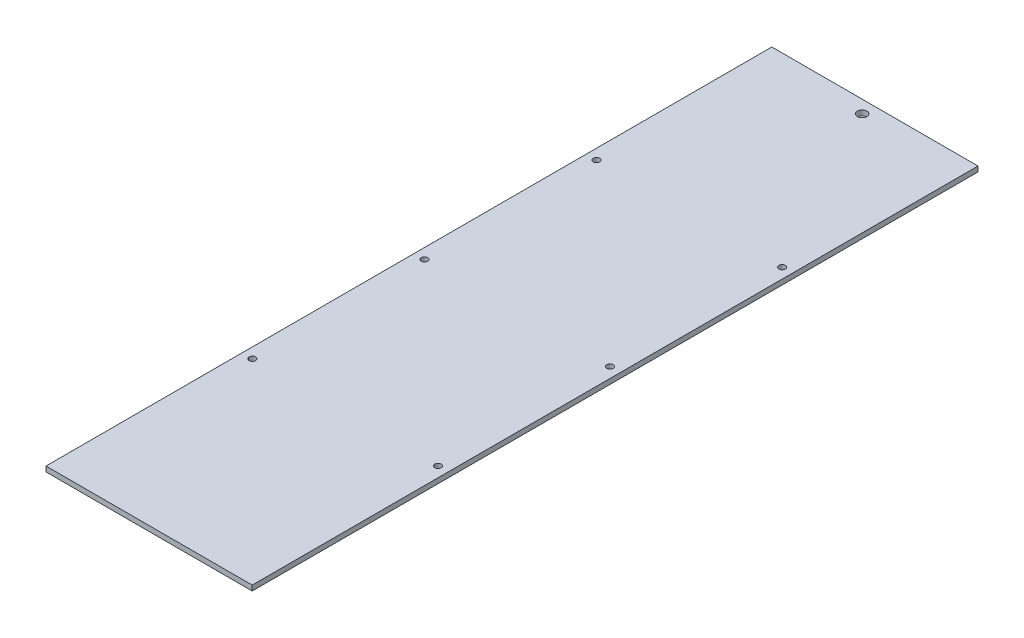
ISO-10303-21;
HEADER;
FILE_DESCRIPTION(('STEP AP214'),'2;1');
FILE_NAME('part.step','',(''),(''),'','','');
FILE_SCHEMA(('AUTOMOTIVE_DESIGN { 1 0 10303 214 1 1 1 1 }'));
ENDSEC;
DATA;
#1=APPLICATION_CONTEXT('core data for automotive mechanical design processes');
#2=APPLICATION_PROTOCOL_DEFINITION('international standard','automotive_design',2000,#1);
#3=PRODUCT_CONTEXT('',#1,'mechanical');
#4=PRODUCT('Part','Part','',(#3));
#5=PRODUCT_RELATED_PRODUCT_CATEGORY('part','',(#4));
#6=PRODUCT_DEFINITION_FORMATION('','',#4);
#7=PRODUCT_DEFINITION_CONTEXT('part definition',#1,'design');
#8=PRODUCT_DEFINITION('design','',#6,#7);
#9=PRODUCT_DEFINITION_SHAPE('','',#8);
#10=(LENGTH_UNIT() NAMED_UNIT(*) SI_UNIT(.MILLI.,.METRE.));
#11=(NAMED_UNIT(*) PLANE_ANGLE_UNIT() SI_UNIT($,.RADIAN.));
#12=(NAMED_UNIT(*) SI_UNIT($,.STERADIAN.) SOLID_ANGLE_UNIT());
#13=UNCERTAINTY_MEASURE_WITH_UNIT(LENGTH_MEASURE(1.E-05),#10,'distance_accuracy_value','');
#14=(GEOMETRIC_REPRESENTATION_CONTEXT(3) GLOBAL_UNCERTAINTY_ASSIGNED_CONTEXT((#13)) GLOBAL_UNIT_ASSIGNED_CONTEXT((#10,
#11,#12)) REPRESENTATION_CONTEXT('',''));
#15=CARTESIAN_POINT('',(0.,0.,0.));
#16=DIRECTION('',(0.,0.,1.));
#17=DIRECTION('',(1.,0.,0.));
#18=AXIS2_PLACEMENT_3D('',#15,#16,#17);
#19=CARTESIAN_POINT('',(0.,2.,0.));
#20=DIRECTION('',(0.,-1.,0.));
#21=DIRECTION('',(0.,0.,-1.));
#22=AXIS2_PLACEMENT_3D('',#19,#20,#21);
#23=PLANE('',#22);
#24=CARTESIAN_POINT('',(36.,2.,-2.04999999999997));
#25=DIRECTION('',(0.,-1.,0.));
#26=DIRECTION('',(0.,0.,1.));
#27=AXIS2_PLACEMENT_3D('',#24,#25,#26);
#28=CIRCLE('',#27,1.25);
#29=CARTESIAN_POINT('',(36.,2.,-0.799999999999971));
#30=VERTEX_POINT('',#29);
#31=EDGE_CURVE('E167',#30,#30,#28,.T.);
#32=ORIENTED_EDGE('',*,*,#31,.T.);
#33=EDGE_LOOP('',(#32));
#34=FACE_BOUND('',#33,.T.);
#35=CARTESIAN_POINT('',(-36.,2.,64.71));
#36=DIRECTION('',(0.,1.,0.));
#37=DIRECTION('',(0.,0.,1.));
#38=AXIS2_PLACEMENT_3D('',#35,#36,#37);
#39=CIRCLE('',#38,1.25);
#40=CARTESIAN_POINT('',(-36.,2.,65.96));
#41=VERTEX_POINT('',#40);
#42=EDGE_CURVE('E11',#41,#41,#39,.T.);
#43=ORIENTED_EDGE('',*,*,#42,.F.);
#44=EDGE_LOOP('',(#43));
#45=FACE_BOUND('',#44,.T.);
#46=DIRECTION('',(0.,0.,-1.));
#47=VECTOR('',#46,1.);
#48=CARTESIAN_POINT('',(40.,2.,140.81));
#49=LINE('',#48,#47);
#50=CARTESIAN_POINT('',(40.,2.,140.81));
#51=VERTEX_POINT('',#50);
#52=CARTESIAN_POINT('',(40.,2.,-140.81));
#53=VERTEX_POINT('',#52);
#54=EDGE_CURVE('E86',#51,#53,#49,.T.);
#55=ORIENTED_EDGE('',*,*,#54,.T.);
#56=DIRECTION('',(-1.,0.,0.));
#57=VECTOR('',#56,1.);
#58=CARTESIAN_POINT('',(-40.,2.,-140.81));
#59=LINE('',#58,#57);
#60=CARTESIAN_POINT('',(-40.,2.,-140.81));
#61=VERTEX_POINT('',#60);
#62=EDGE_CURVE('E81',#53,#61,#59,.T.);
#63=ORIENTED_EDGE('',*,*,#62,.T.);
#64=DIRECTION('',(0.,0.,1.));
#65=VECTOR('',#64,1.);
#66=CARTESIAN_POINT('',(-40.,2.,140.81));
#67=LINE('',#66,#65);
#68=CARTESIAN_POINT('',(-40.,2.,140.81));
#69=VERTEX_POINT('',#68);
#70=EDGE_CURVE('E84',#61,#69,#67,.T.);
#71=ORIENTED_EDGE('',*,*,#70,.T.);
#72=DIRECTION('',(1.,0.,0.));
#73=VECTOR('',#72,1.);
#74=CARTESIAN_POINT('',(-40.,2.,140.81));
#75=LINE('',#74,#73);
#76=EDGE_CURVE('E50',#69,#51,#75,.T.);
#77=ORIENTED_EDGE('',*,*,#76,.T.);
#78=EDGE_LOOP('',(#55,#63,#71,#77));
#79=FACE_BOUND('',#78,.T.);
#80=CARTESIAN_POINT('',(0.,2.,-135.87));
#81=DIRECTION('',(0.,1.,0.));
#82=DIRECTION('',(0.,0.,1.));
#83=AXIS2_PLACEMENT_3D('',#80,#81,#82);
#84=CIRCLE('',#83,1.84999999999999);
#85=CARTESIAN_POINT('',(0.,2.,-134.02));
#86=VERTEX_POINT('',#85);
#87=EDGE_CURVE('E187',#86,#86,#84,.T.);
#88=ORIENTED_EDGE('',*,*,#87,.F.);
#89=EDGE_LOOP('',(#88));
#90=FACE_BOUND('',#89,.T.);
#91=CARTESIAN_POINT('',(-36.,2.,-68.81));
#92=DIRECTION('',(0.,1.,0.));
#93=DIRECTION('',(0.,0.,1.));
#94=AXIS2_PLACEMENT_3D('',#91,#92,#93);
#95=CIRCLE('',#94,1.25);
#96=CARTESIAN_POINT('',(-36.,2.,-67.56));
#97=VERTEX_POINT('',#96);
#98=EDGE_CURVE('E185',#97,#97,#95,.T.);
#99=ORIENTED_EDGE('',*,*,#98,.F.);
#100=EDGE_LOOP('',(#99));
#101=FACE_BOUND('',#100,.T.);
#102=CARTESIAN_POINT('',(-36.,2.,-2.04999999999997));
#103=DIRECTION('',(0.,1.,0.));
#104=DIRECTION('',(0.,0.,1.));
#105=AXIS2_PLACEMENT_3D('',#102,#103,#104);
#106=CIRCLE('',#105,1.25);
#107=CARTESIAN_POINT('',(-36.,2.,-0.799999999999971));
#108=VERTEX_POINT('',#107);
#109=EDGE_CURVE('E182',#108,#108,#106,.T.);
#110=ORIENTED_EDGE('',*,*,#109,.F.);
#111=EDGE_LOOP('',(#110));
#112=FACE_BOUND('',#111,.T.);
#113=CARTESIAN_POINT('',(36.,2.,-68.81));
#114=DIRECTION('',(0.,-1.,0.));
#115=DIRECTION('',(0.,0.,1.));
#116=AXIS2_PLACEMENT_3D('',#113,#114,#115);
#117=CIRCLE('',#116,1.25);
#118=CARTESIAN_POINT('',(36.,2.,-67.56));
#119=VERTEX_POINT('',#118);
#120=EDGE_CURVE('E176',#119,#119,#117,.T.);
#121=ORIENTED_EDGE('',*,*,#120,.T.);
#122=EDGE_LOOP('',(#121));
#123=FACE_BOUND('',#122,.T.);
#124=CARTESIAN_POINT('',(36.,2.,64.71));
#125=DIRECTION('',(0.,-1.,0.));
#126=DIRECTION('',(0.,0.,1.));
#127=AXIS2_PLACEMENT_3D('',#124,#125,#126);
#128=CIRCLE('',#127,1.25);
#129=CARTESIAN_POINT('',(36.,2.,65.96));
#130=VERTEX_POINT('',#129);
#131=EDGE_CURVE('E168',#130,#130,#128,.T.);
#132=ORIENTED_EDGE('',*,*,#131,.T.);
#133=EDGE_LOOP('',(#132));
#134=FACE_BOUND('',#133,.T.);
#135=ADVANCED_FACE('F33',(#34,#45,#79,#90,#101,#112,#123,#134),#23,.F.);
#136=CARTESIAN_POINT('',(0.,0.,0.));
#137=DIRECTION('',(0.,-1.,0.));
#138=DIRECTION('',(0.,0.,-1.));
#139=AXIS2_PLACEMENT_3D('',#136,#137,#138);
#140=PLANE('',#139);
#141=CARTESIAN_POINT('',(36.,0.,-2.04999999999997));
#142=DIRECTION('',(0.,-1.,0.));
#143=DIRECTION('',(0.,0.,1.));
#144=AXIS2_PLACEMENT_3D('',#141,#142,#143);
#145=CIRCLE('',#144,1.25);
#146=CARTESIAN_POINT('',(36.,0.,-0.799999999999971));
#147=VERTEX_POINT('',#146);
#148=EDGE_CURVE('E170',#147,#147,#145,.T.);
#149=ORIENTED_EDGE('',*,*,#148,.F.);
#150=EDGE_LOOP('',(#149));
#151=FACE_BOUND('',#150,.T.);
#152=CARTESIAN_POINT('',(-36.,0.,64.71));
#153=DIRECTION('',(0.,1.,0.));
#154=DIRECTION('',(0.,0.,1.));
#155=AXIS2_PLACEMENT_3D('',#152,#153,#154);
#156=CIRCLE('',#155,1.25);
#157=CARTESIAN_POINT('',(-36.,0.,65.96));
#158=VERTEX_POINT('',#157);
#159=EDGE_CURVE('E42',#158,#158,#156,.T.);
#160=ORIENTED_EDGE('',*,*,#159,.T.);
#161=EDGE_LOOP('',(#160));
#162=FACE_BOUND('',#161,.T.);
#163=DIRECTION('',(0.,0.,-1.));
#164=VECTOR('',#163,1.);
#165=CARTESIAN_POINT('',(40.,0.,140.81));
#166=LINE('',#165,#164);
#167=CARTESIAN_POINT('',(40.,0.,140.81));
#168=VERTEX_POINT('',#167);
#169=CARTESIAN_POINT('',(40.,0.,-140.81));
#170=VERTEX_POINT('',#169);
#171=EDGE_CURVE('E101',#168,#170,#166,.T.);
#172=ORIENTED_EDGE('',*,*,#171,.F.);
#173=DIRECTION('',(1.,0.,0.));
#174=VECTOR('',#173,1.);
#175=CARTESIAN_POINT('',(-40.,0.,140.81));
#176=LINE('',#175,#174);
#177=CARTESIAN_POINT('',(-40.,0.,140.81));
#178=VERTEX_POINT('',#177);
#179=EDGE_CURVE('E73',#178,#168,#176,.T.);
#180=ORIENTED_EDGE('',*,*,#179,.F.);
#181=DIRECTION('',(0.,0.,1.));
#182=VECTOR('',#181,1.);
#183=CARTESIAN_POINT('',(-40.,0.,140.81));
#184=LINE('',#183,#182);
#185=CARTESIAN_POINT('',(-40.,0.,-140.81));
#186=VERTEX_POINT('',#185);
#187=EDGE_CURVE('E67',#186,#178,#184,.T.);
#188=ORIENTED_EDGE('',*,*,#187,.F.);
#189=DIRECTION('',(-1.,0.,0.));
#190=VECTOR('',#189,1.);
#191=CARTESIAN_POINT('',(-40.,0.,-140.81));
#192=LINE('',#191,#190);
#193=EDGE_CURVE('E91',#170,#186,#192,.T.);
#194=ORIENTED_EDGE('',*,*,#193,.F.);
#195=EDGE_LOOP('',(#172,#180,#188,#194));
#196=FACE_BOUND('',#195,.T.);
#197=CARTESIAN_POINT('',(0.,0.,-135.87));
#198=DIRECTION('',(0.,1.,0.));
#199=DIRECTION('',(0.,0.,1.));
#200=AXIS2_PLACEMENT_3D('',#197,#198,#199);
#201=CIRCLE('',#200,1.84999999999999);
#202=CARTESIAN_POINT('',(0.,0.,-134.02));
#203=VERTEX_POINT('',#202);
#204=EDGE_CURVE('E104',#203,#203,#201,.T.);
#205=ORIENTED_EDGE('',*,*,#204,.T.);
#206=EDGE_LOOP('',(#205));
#207=FACE_BOUND('',#206,.T.);
#208=CARTESIAN_POINT('',(-36.,0.,-68.81));
#209=DIRECTION('',(0.,1.,0.));
#210=DIRECTION('',(0.,0.,1.));
#211=AXIS2_PLACEMENT_3D('',#208,#209,#210);
#212=CIRCLE('',#211,1.25);
#213=CARTESIAN_POINT('',(-36.,0.,-67.56));
#214=VERTEX_POINT('',#213);
#215=EDGE_CURVE('E154',#214,#214,#212,.T.);
#216=ORIENTED_EDGE('',*,*,#215,.T.);
#217=EDGE_LOOP('',(#216));
#218=FACE_BOUND('',#217,.T.);
#219=CARTESIAN_POINT('',(-36.,0.,-2.04999999999997));
#220=DIRECTION('',(0.,1.,0.));
#221=DIRECTION('',(0.,0.,1.));
#222=AXIS2_PLACEMENT_3D('',#219,#220,#221);
#223=CIRCLE('',#222,1.25);
#224=CARTESIAN_POINT('',(-36.,0.,-0.799999999999971));
#225=VERTEX_POINT('',#224);
#226=EDGE_CURVE('E158',#225,#225,#223,.T.);
#227=ORIENTED_EDGE('',*,*,#226,.T.);
#228=EDGE_LOOP('',(#227));
#229=FACE_BOUND('',#228,.T.);
#230=CARTESIAN_POINT('',(36.,0.,-68.81));
#231=DIRECTION('',(0.,-1.,0.));
#232=DIRECTION('',(0.,0.,1.));
#233=AXIS2_PLACEMENT_3D('',#230,#231,#232);
#234=CIRCLE('',#233,1.25);
#235=CARTESIAN_POINT('',(36.,0.,-67.56));
#236=VERTEX_POINT('',#235);
#237=EDGE_CURVE('E162',#236,#236,#234,.T.);
#238=ORIENTED_EDGE('',*,*,#237,.F.);
#239=EDGE_LOOP('',(#238));
#240=FACE_BOUND('',#239,.T.);
#241=CARTESIAN_POINT('',(36.,0.,64.71));
#242=DIRECTION('',(0.,-1.,0.));
#243=DIRECTION('',(0.,0.,1.));
#244=AXIS2_PLACEMENT_3D('',#241,#242,#243);
#245=CIRCLE('',#244,1.25);
#246=CARTESIAN_POINT('',(36.,0.,65.96));
#247=VERTEX_POINT('',#246);
#248=EDGE_CURVE('E165',#247,#247,#245,.T.);
#249=ORIENTED_EDGE('',*,*,#248,.F.);
#250=EDGE_LOOP('',(#249));
#251=FACE_BOUND('',#250,.T.);
#252=ADVANCED_FACE('F113',(#151,#162,#196,#207,#218,#229,#240,#251),#140,.T.);
#253=CARTESIAN_POINT('',(40.,2.,140.81));
#254=DIRECTION('',(-1.,0.,0.));
#255=DIRECTION('',(0.,0.,1.));
#256=AXIS2_PLACEMENT_3D('',#253,#254,#255);
#257=PLANE('',#256);
#258=ORIENTED_EDGE('',*,*,#171,.T.);
#259=DIRECTION('',(0.,-1.,0.));
#260=VECTOR('',#259,1.);
#261=CARTESIAN_POINT('',(40.,2.,-140.81));
#262=LINE('',#261,#260);
#263=EDGE_CURVE('E92',#53,#170,#262,.T.);
#264=ORIENTED_EDGE('',*,*,#263,.F.);
#265=ORIENTED_EDGE('',*,*,#54,.F.);
#266=DIRECTION('',(0.,-1.,0.));
#267=VECTOR('',#266,1.);
#268=CARTESIAN_POINT('',(40.,2.,140.81));
#269=LINE('',#268,#267);
#270=EDGE_CURVE('E97',#51,#168,#269,.T.);
#271=ORIENTED_EDGE('',*,*,#270,.T.);
#272=EDGE_LOOP('',(#258,#264,#265,#271));
#273=FACE_BOUND('',#272,.T.);
#274=ADVANCED_FACE('F128',(#273),#257,.F.);
#275=CARTESIAN_POINT('',(-40.,2.,-140.81));
#276=DIRECTION('',(0.,0.,1.));
#277=DIRECTION('',(1.,0.,0.));
#278=AXIS2_PLACEMENT_3D('',#275,#276,#277);
#279=PLANE('',#278);
#280=ORIENTED_EDGE('',*,*,#193,.T.);
#281=DIRECTION('',(0.,-1.,0.));
#282=VECTOR('',#281,1.);
#283=CARTESIAN_POINT('',(-40.,2.,-140.81));
#284=LINE('',#283,#282);
#285=EDGE_CURVE('E89',#61,#186,#284,.T.);
#286=ORIENTED_EDGE('',*,*,#285,.F.);
#287=ORIENTED_EDGE('',*,*,#62,.F.);
#288=ORIENTED_EDGE('',*,*,#263,.T.);
#289=EDGE_LOOP('',(#280,#286,#287,#288));
#290=FACE_BOUND('',#289,.T.);
#291=ADVANCED_FACE('F90',(#290),#279,.F.);
#292=CARTESIAN_POINT('',(-40.,2.,140.81));
#293=DIRECTION('',(1.,0.,0.));
#294=DIRECTION('',(0.,0.,-1.));
#295=AXIS2_PLACEMENT_3D('',#292,#293,#294);
#296=PLANE('',#295);
#297=ORIENTED_EDGE('',*,*,#187,.T.);
#298=DIRECTION('',(0.,-1.,0.));
#299=VECTOR('',#298,1.);
#300=CARTESIAN_POINT('',(-40.,2.,140.81));
#301=LINE('',#300,#299);
#302=EDGE_CURVE('E93',#69,#178,#301,.T.);
#303=ORIENTED_EDGE('',*,*,#302,.F.);
#304=ORIENTED_EDGE('',*,*,#70,.F.);
#305=ORIENTED_EDGE('',*,*,#285,.T.);
#306=EDGE_LOOP('',(#297,#303,#304,#305));
#307=FACE_BOUND('',#306,.T.);
#308=ADVANCED_FACE('F95',(#307),#296,.F.);
#309=CARTESIAN_POINT('',(-40.,2.,140.81));
#310=DIRECTION('',(0.,0.,-1.));
#311=DIRECTION('',(-1.,0.,0.));
#312=AXIS2_PLACEMENT_3D('',#309,#310,#311);
#313=PLANE('',#312);
#314=ORIENTED_EDGE('',*,*,#179,.T.);
#315=ORIENTED_EDGE('',*,*,#270,.F.);
#316=ORIENTED_EDGE('',*,*,#76,.F.);
#317=ORIENTED_EDGE('',*,*,#302,.T.);
#318=EDGE_LOOP('',(#314,#315,#316,#317));
#319=FACE_BOUND('',#318,.T.);
#320=ADVANCED_FACE('F136',(#319),#313,.F.);
#321=CARTESIAN_POINT('',(0.,0.,-135.87));
#322=DIRECTION('',(0.,1.,0.));
#323=DIRECTION('',(0.,0.,1.));
#324=AXIS2_PLACEMENT_3D('',#321,#322,#323);
#325=CYLINDRICAL_SURFACE('',#324,1.84999999999999);
#326=ORIENTED_EDGE('',*,*,#204,.F.);
#327=EDGE_LOOP('',(#326));
#328=FACE_BOUND('',#327,.T.);
#329=ORIENTED_EDGE('',*,*,#87,.T.);
#330=EDGE_LOOP('',(#329));
#331=FACE_BOUND('',#330,.T.);
#332=ADVANCED_FACE('F133',(#328,#331),#325,.F.);
#333=CARTESIAN_POINT('',(-36.,0.,-68.81));
#334=DIRECTION('',(0.,1.,0.));
#335=DIRECTION('',(0.,0.,1.));
#336=AXIS2_PLACEMENT_3D('',#333,#334,#335);
#337=CYLINDRICAL_SURFACE('',#336,1.25);
#338=ORIENTED_EDGE('',*,*,#215,.F.);
#339=EDGE_LOOP('',(#338));
#340=FACE_BOUND('',#339,.T.);
#341=ORIENTED_EDGE('',*,*,#98,.T.);
#342=EDGE_LOOP('',(#341));
#343=FACE_BOUND('',#342,.T.);
#344=ADVANCED_FACE('F217',(#340,#343),#337,.F.);
#345=CARTESIAN_POINT('',(-36.,0.,-2.04999999999997));
#346=DIRECTION('',(0.,1.,0.));
#347=DIRECTION('',(0.,0.,1.));
#348=AXIS2_PLACEMENT_3D('',#345,#346,#347);
#349=CYLINDRICAL_SURFACE('',#348,1.25);
#350=ORIENTED_EDGE('',*,*,#226,.F.);
#351=EDGE_LOOP('',(#350));
#352=FACE_BOUND('',#351,.T.);
#353=ORIENTED_EDGE('',*,*,#109,.T.);
#354=EDGE_LOOP('',(#353));
#355=FACE_BOUND('',#354,.T.);
#356=ADVANCED_FACE('F119',(#352,#355),#349,.F.);
#357=CARTESIAN_POINT('',(-36.,0.,64.71));
#358=DIRECTION('',(0.,1.,0.));
#359=DIRECTION('',(0.,0.,1.));
#360=AXIS2_PLACEMENT_3D('',#357,#358,#359);
#361=CYLINDRICAL_SURFACE('',#360,1.25);
#362=ORIENTED_EDGE('',*,*,#159,.F.);
#363=EDGE_LOOP('',(#362));
#364=FACE_BOUND('',#363,.T.);
#365=ORIENTED_EDGE('',*,*,#42,.T.);
#366=EDGE_LOOP('',(#365));
#367=FACE_BOUND('',#366,.T.);
#368=ADVANCED_FACE('F35',(#364,#367),#361,.F.);
#369=CARTESIAN_POINT('',(36.,0.,-68.81));
#370=DIRECTION('',(0.,1.,0.));
#371=DIRECTION('',(0.,0.,1.));
#372=AXIS2_PLACEMENT_3D('',#369,#370,#371);
#373=CYLINDRICAL_SURFACE('',#372,1.25);
#374=ORIENTED_EDGE('',*,*,#237,.T.);
#375=EDGE_LOOP('',(#374));
#376=FACE_BOUND('',#375,.T.);
#377=ORIENTED_EDGE('',*,*,#120,.F.);
#378=EDGE_LOOP('',(#377));
#379=FACE_BOUND('',#378,.T.);
#380=ADVANCED_FACE('F118',(#376,#379),#373,.F.);
#381=CARTESIAN_POINT('',(36.,0.,-2.04999999999997));
#382=DIRECTION('',(0.,1.,0.));
#383=DIRECTION('',(0.,0.,1.));
#384=AXIS2_PLACEMENT_3D('',#381,#382,#383);
#385=CYLINDRICAL_SURFACE('',#384,1.25);
#386=ORIENTED_EDGE('',*,*,#148,.T.);
#387=EDGE_LOOP('',(#386));
#388=FACE_BOUND('',#387,.T.);
#389=ORIENTED_EDGE('',*,*,#31,.F.);
#390=EDGE_LOOP('',(#389));
#391=FACE_BOUND('',#390,.T.);
#392=ADVANCED_FACE('F205',(#388,#391),#385,.F.);
#393=CARTESIAN_POINT('',(36.,0.,64.71));
#394=DIRECTION('',(0.,1.,0.));
#395=DIRECTION('',(0.,0.,1.));
#396=AXIS2_PLACEMENT_3D('',#393,#394,#395);
#397=CYLINDRICAL_SURFACE('',#396,1.25);
#398=ORIENTED_EDGE('',*,*,#248,.T.);
#399=EDGE_LOOP('',(#398));
#400=FACE_BOUND('',#399,.T.);
#401=ORIENTED_EDGE('',*,*,#131,.F.);
#402=EDGE_LOOP('',(#401));
#403=FACE_BOUND('',#402,.T.);
#404=ADVANCED_FACE('F203',(#400,#403),#397,.F.);
#405=CLOSED_SHELL('',(#135,#252,#274,#291,#308,#320,#332,#344,#356,#368,#380,#392,#404));
#406=MANIFOLD_SOLID_BREP('B2',#405);
#407=ADVANCED_BREP_SHAPE_REPRESENTATION('',(#18,#406),#14);
#408=SHAPE_DEFINITION_REPRESENTATION(#9,#407);
ENDSEC;
END-ISO-10303-21;
